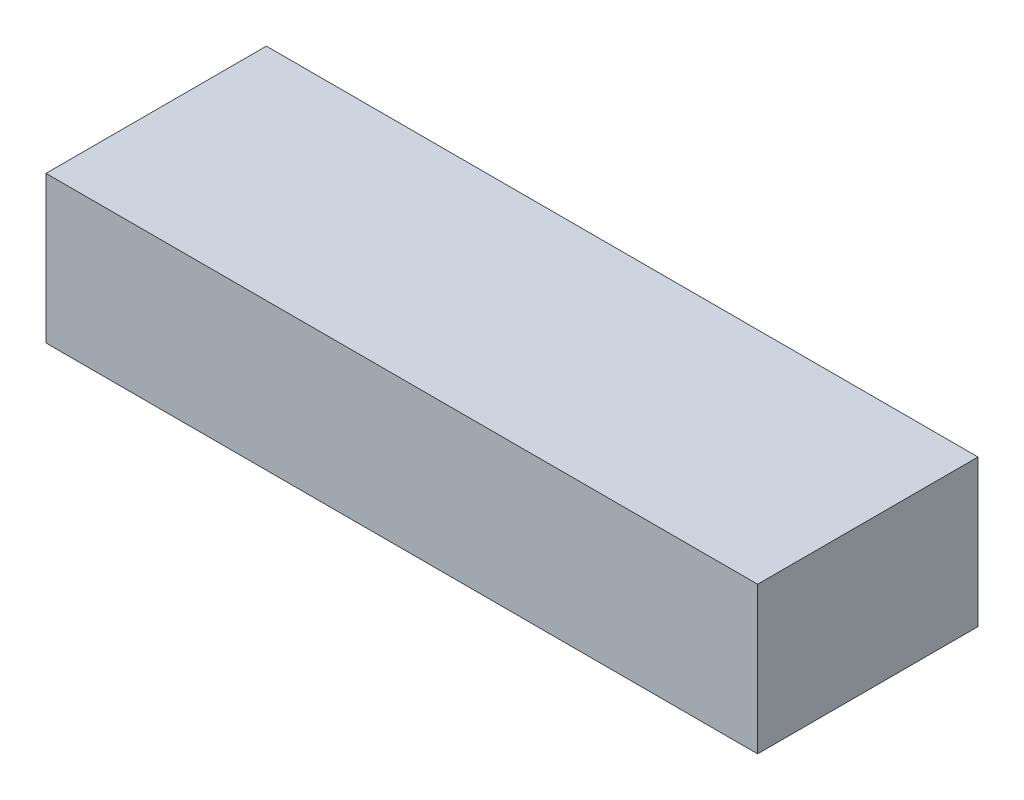
ISO-10303-21;
HEADER;
FILE_DESCRIPTION(('STEP AP214'),'2;1');
FILE_NAME('part.step','',(''),(''),'','','');
FILE_SCHEMA(('AUTOMOTIVE_DESIGN { 1 0 10303 214 1 1 1 1 }'));
ENDSEC;
DATA;
#1=APPLICATION_CONTEXT('core data for automotive mechanical design processes');
#2=APPLICATION_PROTOCOL_DEFINITION('international standard','automotive_design',2000,#1);
#3=PRODUCT_CONTEXT('',#1,'mechanical');
#4=PRODUCT('Part','Part','',(#3));
#5=PRODUCT_RELATED_PRODUCT_CATEGORY('part','',(#4));
#6=PRODUCT_DEFINITION_FORMATION('','',#4);
#7=PRODUCT_DEFINITION_CONTEXT('part definition',#1,'design');
#8=PRODUCT_DEFINITION('design','',#6,#7);
#9=PRODUCT_DEFINITION_SHAPE('','',#8);
#10=(LENGTH_UNIT() NAMED_UNIT(*) SI_UNIT(.MILLI.,.METRE.));
#11=(NAMED_UNIT(*) PLANE_ANGLE_UNIT() SI_UNIT($,.RADIAN.));
#12=(NAMED_UNIT(*) SI_UNIT($,.STERADIAN.) SOLID_ANGLE_UNIT());
#13=UNCERTAINTY_MEASURE_WITH_UNIT(LENGTH_MEASURE(1.E-05),#10,'distance_accuracy_value','');
#14=(GEOMETRIC_REPRESENTATION_CONTEXT(3) GLOBAL_UNCERTAINTY_ASSIGNED_CONTEXT((#13)) GLOBAL_UNIT_ASSIGNED_CONTEXT((#10,
#11,#12)) REPRESENTATION_CONTEXT('',''));
#15=CARTESIAN_POINT('',(0.,0.,0.));
#16=DIRECTION('',(0.,0.,1.));
#17=DIRECTION('',(1.,0.,0.));
#18=AXIS2_PLACEMENT_3D('',#15,#16,#17);
#19=CARTESIAN_POINT('',(-77.5,16.,-24.));
#20=DIRECTION('',(1.,0.,0.));
#21=DIRECTION('',(0.,0.,-1.));
#22=AXIS2_PLACEMENT_3D('',#19,#20,#21);
#23=PLANE('',#22);
#24=DIRECTION('',(0.,0.,1.));
#25=VECTOR('',#24,1.);
#26=CARTESIAN_POINT('',(-77.5,-16.,-24.));
#27=LINE('',#26,#25);
#28=CARTESIAN_POINT('',(-77.5,-16.,-24.));
#29=VERTEX_POINT('',#28);
#30=CARTESIAN_POINT('',(-77.5,-16.,24.));
#31=VERTEX_POINT('',#30);
#32=EDGE_CURVE('E106',#29,#31,#27,.T.);
#33=ORIENTED_EDGE('',*,*,#32,.T.);
#34=DIRECTION('',(0.,-1.,0.));
#35=VECTOR('',#34,1.);
#36=CARTESIAN_POINT('',(-77.5,16.,24.));
#37=LINE('',#36,#35);
#38=CARTESIAN_POINT('',(-77.5,16.,24.));
#39=VERTEX_POINT('',#38);
#40=EDGE_CURVE('E11',#39,#31,#37,.T.);
#41=ORIENTED_EDGE('',*,*,#40,.F.);
#42=DIRECTION('',(0.,0.,1.));
#43=VECTOR('',#42,1.);
#44=CARTESIAN_POINT('',(-77.5,16.,-24.));
#45=LINE('',#44,#43);
#46=CARTESIAN_POINT('',(-77.5,16.,-24.));
#47=VERTEX_POINT('',#46);
#48=EDGE_CURVE('E94',#47,#39,#45,.T.);
#49=ORIENTED_EDGE('',*,*,#48,.F.);
#50=DIRECTION('',(0.,-1.,0.));
#51=VECTOR('',#50,1.);
#52=CARTESIAN_POINT('',(-77.5,16.,-24.));
#53=LINE('',#52,#51);
#54=EDGE_CURVE('E102',#47,#29,#53,.T.);
#55=ORIENTED_EDGE('',*,*,#54,.T.);
#56=EDGE_LOOP('',(#33,#41,#49,#55));
#57=FACE_BOUND('',#56,.T.);
#58=ADVANCED_FACE('F43',(#57),#23,.F.);
#59=CARTESIAN_POINT('',(77.5,16.,24.));
#60=DIRECTION('',(0.,0.,-1.));
#61=DIRECTION('',(-1.,0.,0.));
#62=AXIS2_PLACEMENT_3D('',#59,#60,#61);
#63=PLANE('',#62);
#64=DIRECTION('',(1.,0.,0.));
#65=VECTOR('',#64,1.);
#66=CARTESIAN_POINT('',(77.5,-16.,24.));
#67=LINE('',#66,#65);
#68=CARTESIAN_POINT('',(77.5,-16.,24.));
#69=VERTEX_POINT('',#68);
#70=EDGE_CURVE('E98',#31,#69,#67,.T.);
#71=ORIENTED_EDGE('',*,*,#70,.T.);
#72=DIRECTION('',(0.,-1.,0.));
#73=VECTOR('',#72,1.);
#74=CARTESIAN_POINT('',(77.5,16.,24.));
#75=LINE('',#74,#73);
#76=CARTESIAN_POINT('',(77.5,16.,24.));
#77=VERTEX_POINT('',#76);
#78=EDGE_CURVE('E51',#77,#69,#75,.T.);
#79=ORIENTED_EDGE('',*,*,#78,.F.);
#80=DIRECTION('',(1.,0.,0.));
#81=VECTOR('',#80,1.);
#82=CARTESIAN_POINT('',(77.5,16.,24.));
#83=LINE('',#82,#81);
#84=EDGE_CURVE('E89',#39,#77,#83,.T.);
#85=ORIENTED_EDGE('',*,*,#84,.F.);
#86=ORIENTED_EDGE('',*,*,#40,.T.);
#87=EDGE_LOOP('',(#71,#79,#85,#86));
#88=FACE_BOUND('',#87,.T.);
#89=ADVANCED_FACE('F97',(#88),#63,.F.);
#90=CARTESIAN_POINT('',(77.5,16.,-24.));
#91=DIRECTION('',(-1.,0.,0.));
#92=DIRECTION('',(0.,0.,1.));
#93=AXIS2_PLACEMENT_3D('',#90,#91,#92);
#94=PLANE('',#93);
#95=DIRECTION('',(0.,0.,-1.));
#96=VECTOR('',#95,1.);
#97=CARTESIAN_POINT('',(77.5,-16.,-24.));
#98=LINE('',#97,#96);
#99=CARTESIAN_POINT('',(77.5,-16.,-24.));
#100=VERTEX_POINT('',#99);
#101=EDGE_CURVE('E76',#69,#100,#98,.T.);
#102=ORIENTED_EDGE('',*,*,#101,.T.);
#103=DIRECTION('',(0.,-1.,0.));
#104=VECTOR('',#103,1.);
#105=CARTESIAN_POINT('',(77.5,16.,-24.));
#106=LINE('',#105,#104);
#107=CARTESIAN_POINT('',(77.5,16.,-24.));
#108=VERTEX_POINT('',#107);
#109=EDGE_CURVE('E99',#108,#100,#106,.T.);
#110=ORIENTED_EDGE('',*,*,#109,.F.);
#111=DIRECTION('',(0.,0.,-1.));
#112=VECTOR('',#111,1.);
#113=CARTESIAN_POINT('',(77.5,16.,-24.));
#114=LINE('',#113,#112);
#115=EDGE_CURVE('E92',#77,#108,#114,.T.);
#116=ORIENTED_EDGE('',*,*,#115,.F.);
#117=ORIENTED_EDGE('',*,*,#78,.T.);
#118=EDGE_LOOP('',(#102,#110,#116,#117));
#119=FACE_BOUND('',#118,.T.);
#120=ADVANCED_FACE('F100',(#119),#94,.F.);
#121=CARTESIAN_POINT('',(77.5,16.,-24.));
#122=DIRECTION('',(0.,0.,1.));
#123=DIRECTION('',(1.,0.,0.));
#124=AXIS2_PLACEMENT_3D('',#121,#122,#123);
#125=PLANE('',#124);
#126=DIRECTION('',(-1.,0.,0.));
#127=VECTOR('',#126,1.);
#128=CARTESIAN_POINT('',(77.5,-16.,-24.));
#129=LINE('',#128,#127);
#130=EDGE_CURVE('E82',#100,#29,#129,.T.);
#131=ORIENTED_EDGE('',*,*,#130,.T.);
#132=ORIENTED_EDGE('',*,*,#54,.F.);
#133=DIRECTION('',(-1.,0.,0.));
#134=VECTOR('',#133,1.);
#135=CARTESIAN_POINT('',(77.5,16.,-24.));
#136=LINE('',#135,#134);
#137=EDGE_CURVE('E59',#108,#47,#136,.T.);
#138=ORIENTED_EDGE('',*,*,#137,.F.);
#139=ORIENTED_EDGE('',*,*,#109,.T.);
#140=EDGE_LOOP('',(#131,#132,#138,#139));
#141=FACE_BOUND('',#140,.T.);
#142=ADVANCED_FACE('F113',(#141),#125,.F.);
#143=CARTESIAN_POINT('',(0.,16.,0.));
#144=DIRECTION('',(0.,-1.,0.));
#145=DIRECTION('',(0.,0.,-1.));
#146=AXIS2_PLACEMENT_3D('',#143,#144,#145);
#147=PLANE('',#146);
#148=ORIENTED_EDGE('',*,*,#48,.T.);
#149=ORIENTED_EDGE('',*,*,#84,.T.);
#150=ORIENTED_EDGE('',*,*,#115,.T.);
#151=ORIENTED_EDGE('',*,*,#137,.T.);
#152=EDGE_LOOP('',(#148,#149,#150,#151));
#153=FACE_BOUND('',#152,.T.);
#154=ADVANCED_FACE('F90',(#153),#147,.F.);
#155=CARTESIAN_POINT('',(0.,-16.,0.));
#156=DIRECTION('',(0.,-1.,0.));
#157=DIRECTION('',(0.,0.,-1.));
#158=AXIS2_PLACEMENT_3D('',#155,#156,#157);
#159=PLANE('',#158);
#160=ORIENTED_EDGE('',*,*,#32,.F.);
#161=ORIENTED_EDGE('',*,*,#130,.F.);
#162=ORIENTED_EDGE('',*,*,#101,.F.);
#163=ORIENTED_EDGE('',*,*,#70,.F.);
#164=EDGE_LOOP('',(#160,#161,#162,#163));
#165=FACE_BOUND('',#164,.T.);
#166=ADVANCED_FACE('F116',(#165),#159,.T.);
#167=CLOSED_SHELL('',(#58,#89,#120,#142,#154,#166));
#168=MANIFOLD_SOLID_BREP('B2',#167);
#169=ADVANCED_BREP_SHAPE_REPRESENTATION('',(#18,#168),#14);
#170=SHAPE_DEFINITION_REPRESENTATION(#9,#169);
ENDSEC;
END-ISO-10303-21;
